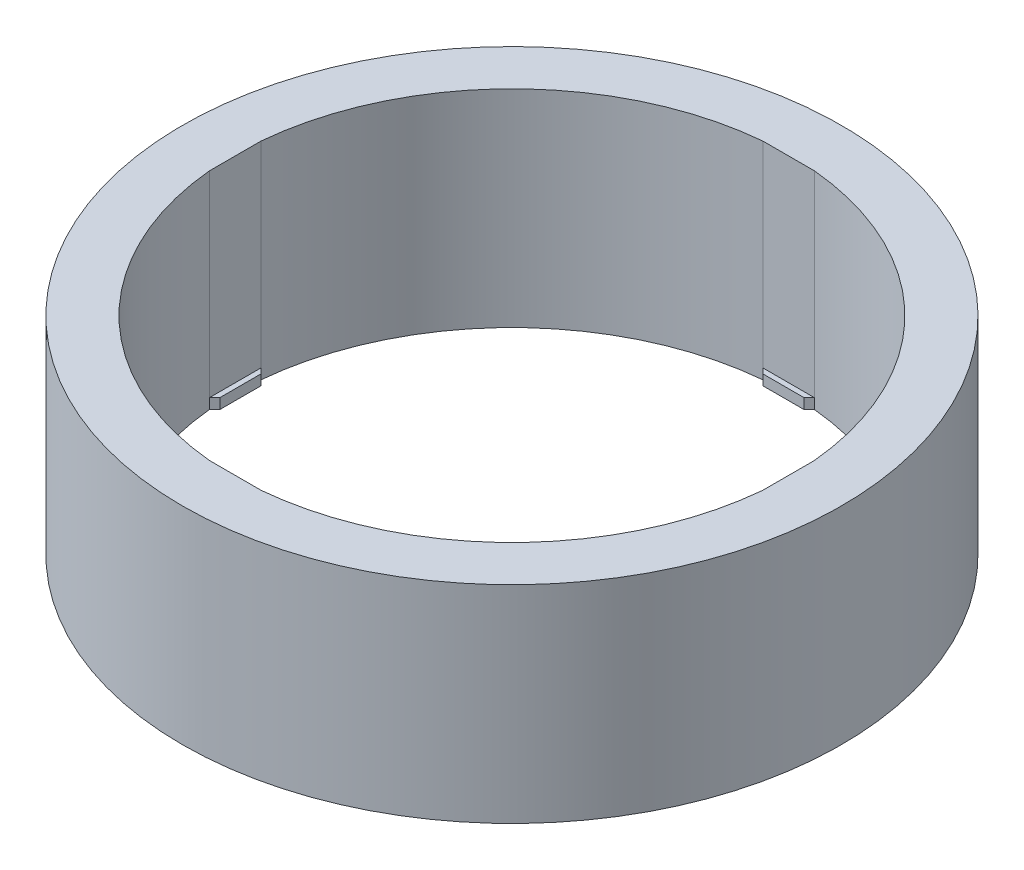
ISO-10303-21;
HEADER;
FILE_DESCRIPTION(('STEP AP214'),'2;1');
FILE_NAME('part.step','',(''),(''),'','','');
FILE_SCHEMA(('AUTOMOTIVE_DESIGN { 1 0 10303 214 1 1 1 1 }'));
ENDSEC;
DATA;
#1=APPLICATION_CONTEXT('core data for automotive mechanical design processes');
#2=APPLICATION_PROTOCOL_DEFINITION('international standard','automotive_design',2000,#1);
#3=PRODUCT_CONTEXT('',#1,'mechanical');
#4=PRODUCT('Part','Part','',(#3));
#5=PRODUCT_RELATED_PRODUCT_CATEGORY('part','',(#4));
#6=PRODUCT_DEFINITION_FORMATION('','',#4);
#7=PRODUCT_DEFINITION_CONTEXT('part definition',#1,'design');
#8=PRODUCT_DEFINITION('design','',#6,#7);
#9=PRODUCT_DEFINITION_SHAPE('','',#8);
#10=(LENGTH_UNIT() NAMED_UNIT(*) SI_UNIT(.MILLI.,.METRE.));
#11=(NAMED_UNIT(*) PLANE_ANGLE_UNIT() SI_UNIT($,.RADIAN.));
#12=(NAMED_UNIT(*) SI_UNIT($,.STERADIAN.) SOLID_ANGLE_UNIT());
#13=UNCERTAINTY_MEASURE_WITH_UNIT(LENGTH_MEASURE(1.E-05),#10,'distance_accuracy_value','');
#14=(GEOMETRIC_REPRESENTATION_CONTEXT(3) GLOBAL_UNCERTAINTY_ASSIGNED_CONTEXT((#13)) GLOBAL_UNIT_ASSIGNED_CONTEXT((#10,
#11,#12)) REPRESENTATION_CONTEXT('',''));
#15=CARTESIAN_POINT('',(0.,0.,0.));
#16=DIRECTION('',(0.,0.,1.));
#17=DIRECTION('',(1.,0.,0.));
#18=AXIS2_PLACEMENT_3D('',#15,#16,#17);
#19=CARTESIAN_POINT('',(10.7033873143038,8.,-0.999999999999966));
#20=DIRECTION('',(-1.,0.,0.));
#21=DIRECTION('',(0.,0.,1.));
#22=AXIS2_PLACEMENT_3D('',#19,#20,#21);
#23=PLANE('',#22);
#24=DIRECTION('',(0.,-1.,0.));
#25=VECTOR('',#24,1.);
#26=CARTESIAN_POINT('',(10.7033873143038,8.,-0.999999999999964));
#27=LINE('',#26,#25);
#28=CARTESIAN_POINT('',(10.7033873143038,8.,-0.999999999999964));
#29=VERTEX_POINT('',#28);
#30=CARTESIAN_POINT('',(10.7033873143038,0.4,-0.999999999999964));
#31=VERTEX_POINT('',#30);
#32=EDGE_CURVE('E273',#29,#31,#27,.T.);
#33=ORIENTED_EDGE('',*,*,#32,.T.);
#34=DIRECTION('',(0.,0.,-1.));
#35=VECTOR('',#34,1.);
#36=CARTESIAN_POINT('',(10.7033873143038,0.4,-0.999999999999964));
#37=LINE('',#36,#35);
#38=CARTESIAN_POINT('',(10.7033873143038,0.4,1.00000000000004));
#39=VERTEX_POINT('',#38);
#40=EDGE_CURVE('E196',#39,#31,#37,.T.);
#41=ORIENTED_EDGE('',*,*,#40,.F.);
#42=DIRECTION('',(0.,-1.,0.));
#43=VECTOR('',#42,1.);
#44=CARTESIAN_POINT('',(10.7033873143038,8.,1.00000000000004));
#45=LINE('',#44,#43);
#46=CARTESIAN_POINT('',(10.7033873143038,8.,1.00000000000004));
#47=VERTEX_POINT('',#46);
#48=EDGE_CURVE('E275',#47,#39,#45,.T.);
#49=ORIENTED_EDGE('',*,*,#48,.F.);
#50=DIRECTION('',(0.,0.,-1.));
#51=VECTOR('',#50,1.);
#52=CARTESIAN_POINT('',(10.7033873143038,8.,-0.999999999999966));
#53=LINE('',#52,#51);
#54=EDGE_CURVE('E255',#47,#29,#53,.T.);
#55=ORIENTED_EDGE('',*,*,#54,.T.);
#56=EDGE_LOOP('',(#33,#41,#49,#55));
#57=FACE_BOUND('',#56,.T.);
#58=ADVANCED_FACE('F33',(#57),#23,.T.);
#59=CARTESIAN_POINT('',(0.999999999999926,8.,10.7033873143038));
#60=DIRECTION('',(0.,0.,-1.));
#61=DIRECTION('',(-1.,0.,0.));
#62=AXIS2_PLACEMENT_3D('',#59,#60,#61);
#63=PLANE('',#62);
#64=DIRECTION('',(0.,-1.,0.));
#65=VECTOR('',#64,1.);
#66=CARTESIAN_POINT('',(0.999999999999926,8.,10.7033873143038));
#67=LINE('',#66,#65);
#68=CARTESIAN_POINT('',(0.999999999999926,8.,10.7033873143038));
#69=VERTEX_POINT('',#68);
#70=CARTESIAN_POINT('',(0.999999999999926,0.4,10.7033873143038));
#71=VERTEX_POINT('',#70);
#72=EDGE_CURVE('E278',#69,#71,#67,.T.);
#73=ORIENTED_EDGE('',*,*,#72,.T.);
#74=DIRECTION('',(1.,0.,0.));
#75=VECTOR('',#74,1.);
#76=CARTESIAN_POINT('',(0.999999999999926,0.4,10.7033873143038));
#77=LINE('',#76,#75);
#78=CARTESIAN_POINT('',(-1.00000000000008,0.4,10.7033873143038));
#79=VERTEX_POINT('',#78);
#80=EDGE_CURVE('E207',#79,#71,#77,.T.);
#81=ORIENTED_EDGE('',*,*,#80,.F.);
#82=DIRECTION('',(0.,-1.,0.));
#83=VECTOR('',#82,1.);
#84=CARTESIAN_POINT('',(-1.00000000000008,8.,10.7033873143038));
#85=LINE('',#84,#83);
#86=CARTESIAN_POINT('',(-1.00000000000008,8.,10.7033873143038));
#87=VERTEX_POINT('',#86);
#88=EDGE_CURVE('E281',#87,#79,#85,.T.);
#89=ORIENTED_EDGE('',*,*,#88,.F.);
#90=DIRECTION('',(1.,0.,0.));
#91=VECTOR('',#90,1.);
#92=CARTESIAN_POINT('',(0.999999999999926,8.,10.7033873143038));
#93=LINE('',#92,#91);
#94=EDGE_CURVE('E251',#87,#69,#93,.T.);
#95=ORIENTED_EDGE('',*,*,#94,.T.);
#96=EDGE_LOOP('',(#73,#81,#89,#95));
#97=FACE_BOUND('',#96,.T.);
#98=ADVANCED_FACE('F366',(#97),#63,.T.);
#99=CARTESIAN_POINT('',(-10.7033873143038,8.,0.999999999999891));
#100=DIRECTION('',(1.,0.,0.));
#101=DIRECTION('',(0.,0.,-1.));
#102=AXIS2_PLACEMENT_3D('',#99,#100,#101);
#103=PLANE('',#102);
#104=DIRECTION('',(0.,-1.,0.));
#105=VECTOR('',#104,1.);
#106=CARTESIAN_POINT('',(-10.7033873143038,8.,0.999999999999889));
#107=LINE('',#106,#105);
#108=CARTESIAN_POINT('',(-10.7033873143038,8.,0.999999999999889));
#109=VERTEX_POINT('',#108);
#110=CARTESIAN_POINT('',(-10.7033873143038,0.4,0.999999999999889));
#111=VERTEX_POINT('',#110);
#112=EDGE_CURVE('E284',#109,#111,#107,.T.);
#113=ORIENTED_EDGE('',*,*,#112,.T.);
#114=DIRECTION('',(0.,0.,1.));
#115=VECTOR('',#114,1.);
#116=CARTESIAN_POINT('',(-10.7033873143038,0.4,0.999999999999889));
#117=LINE('',#116,#115);
#118=CARTESIAN_POINT('',(-10.7033873143038,0.4,-1.00000000000011));
#119=VERTEX_POINT('',#118);
#120=EDGE_CURVE('E223',#119,#111,#117,.T.);
#121=ORIENTED_EDGE('',*,*,#120,.F.);
#122=DIRECTION('',(0.,-1.,0.));
#123=VECTOR('',#122,1.);
#124=CARTESIAN_POINT('',(-10.7033873143038,8.,-1.00000000000011));
#125=LINE('',#124,#123);
#126=CARTESIAN_POINT('',(-10.7033873143038,8.,-1.00000000000011));
#127=VERTEX_POINT('',#126);
#128=EDGE_CURVE('E287',#127,#119,#125,.T.);
#129=ORIENTED_EDGE('',*,*,#128,.F.);
#130=DIRECTION('',(0.,0.,1.));
#131=VECTOR('',#130,1.);
#132=CARTESIAN_POINT('',(-10.7033873143038,8.,0.999999999999891));
#133=LINE('',#132,#131);
#134=EDGE_CURVE('E247',#127,#109,#133,.T.);
#135=ORIENTED_EDGE('',*,*,#134,.T.);
#136=EDGE_LOOP('',(#113,#121,#129,#135));
#137=FACE_BOUND('',#136,.T.);
#138=ADVANCED_FACE('F371',(#137),#103,.T.);
#139=CARTESIAN_POINT('',(-1.,8.,-10.7033873143038));
#140=DIRECTION('',(0.,0.,1.));
#141=DIRECTION('',(1.,0.,0.));
#142=AXIS2_PLACEMENT_3D('',#139,#140,#141);
#143=PLANE('',#142);
#144=DIRECTION('',(0.,-1.,0.));
#145=VECTOR('',#144,1.);
#146=CARTESIAN_POINT('',(-1.,8.,-10.7033873143038));
#147=LINE('',#146,#145);
#148=CARTESIAN_POINT('',(-1.,8.,-10.7033873143038));
#149=VERTEX_POINT('',#148);
#150=CARTESIAN_POINT('',(-1.,0.4,-10.7033873143038));
#151=VERTEX_POINT('',#150);
#152=EDGE_CURVE('E262',#149,#151,#147,.T.);
#153=ORIENTED_EDGE('',*,*,#152,.T.);
#154=DIRECTION('',(-1.,0.,0.));
#155=VECTOR('',#154,1.);
#156=CARTESIAN_POINT('',(-1.,0.4,-10.7033873143038));
#157=LINE('',#156,#155);
#158=CARTESIAN_POINT('',(1.,0.4,-10.7033873143038));
#159=VERTEX_POINT('',#158);
#160=EDGE_CURVE('E238',#159,#151,#157,.T.);
#161=ORIENTED_EDGE('',*,*,#160,.F.);
#162=DIRECTION('',(0.,-1.,0.));
#163=VECTOR('',#162,1.);
#164=CARTESIAN_POINT('',(1.,8.,-10.7033873143038));
#165=LINE('',#164,#163);
#166=CARTESIAN_POINT('',(1.,8.,-10.7033873143038));
#167=VERTEX_POINT('',#166);
#168=EDGE_CURVE('E271',#167,#159,#165,.T.);
#169=ORIENTED_EDGE('',*,*,#168,.F.);
#170=DIRECTION('',(-1.,0.,0.));
#171=VECTOR('',#170,1.);
#172=CARTESIAN_POINT('',(-1.,8.,-10.7033873143038));
#173=LINE('',#172,#171);
#174=EDGE_CURVE('E260',#167,#149,#173,.T.);
#175=ORIENTED_EDGE('',*,*,#174,.T.);
#176=EDGE_LOOP('',(#153,#161,#169,#175));
#177=FACE_BOUND('',#176,.T.);
#178=ADVANCED_FACE('F386',(#177),#143,.T.);
#179=CARTESIAN_POINT('',(0.,8.,0.));
#180=DIRECTION('',(0.,1.,0.));
#181=DIRECTION('',(0.,0.,1.));
#182=AXIS2_PLACEMENT_3D('',#179,#180,#181);
#183=PLANE('',#182);
#184=CARTESIAN_POINT('',(0.,8.,0.));
#185=DIRECTION('',(0.,1.,0.));
#186=DIRECTION('',(0.,0.,1.));
#187=AXIS2_PLACEMENT_3D('',#184,#185,#186);
#188=CIRCLE('',#187,12.75);
#189=CARTESIAN_POINT('',(0.,8.,12.75));
#190=VERTEX_POINT('',#189);
#191=EDGE_CURVE('E291',#190,#190,#188,.T.);
#192=ORIENTED_EDGE('',*,*,#191,.T.);
#193=EDGE_LOOP('',(#192));
#194=FACE_BOUND('',#193,.T.);
#195=ORIENTED_EDGE('',*,*,#134,.F.);
#196=CARTESIAN_POINT('',(0.,8.,0.));
#197=DIRECTION('',(0.,1.,0.));
#198=DIRECTION('',(0.,0.,1.));
#199=AXIS2_PLACEMENT_3D('',#196,#197,#198);
#200=CIRCLE('',#199,10.75);
#201=EDGE_CURVE('E191',#149,#127,#200,.T.);
#202=ORIENTED_EDGE('',*,*,#201,.F.);
#203=ORIENTED_EDGE('',*,*,#174,.F.);
#204=CARTESIAN_POINT('',(0.,8.,0.));
#205=DIRECTION('',(0.,1.,0.));
#206=DIRECTION('',(0.,0.,1.));
#207=AXIS2_PLACEMENT_3D('',#204,#205,#206);
#208=CIRCLE('',#207,10.75);
#209=EDGE_CURVE('E257',#29,#167,#208,.T.);
#210=ORIENTED_EDGE('',*,*,#209,.F.);
#211=ORIENTED_EDGE('',*,*,#54,.F.);
#212=CARTESIAN_POINT('',(0.,8.,0.));
#213=DIRECTION('',(0.,1.,0.));
#214=DIRECTION('',(0.,0.,1.));
#215=AXIS2_PLACEMENT_3D('',#212,#213,#214);
#216=CIRCLE('',#215,10.75);
#217=EDGE_CURVE('E253',#69,#47,#216,.T.);
#218=ORIENTED_EDGE('',*,*,#217,.F.);
#219=ORIENTED_EDGE('',*,*,#94,.F.);
#220=CARTESIAN_POINT('',(0.,8.,0.));
#221=DIRECTION('',(0.,1.,0.));
#222=DIRECTION('',(0.,0.,1.));
#223=AXIS2_PLACEMENT_3D('',#220,#221,#222);
#224=CIRCLE('',#223,10.75);
#225=EDGE_CURVE('E249',#109,#87,#224,.T.);
#226=ORIENTED_EDGE('',*,*,#225,.F.);
#227=EDGE_LOOP('',(#195,#202,#203,#210,#211,#218,#219,#226));
#228=FACE_BOUND('',#227,.T.);
#229=ADVANCED_FACE('F392',(#194,#228),#183,.T.);
#230=CARTESIAN_POINT('',(0.,0.,0.));
#231=DIRECTION('',(0.,1.,0.));
#232=DIRECTION('',(0.,0.,1.));
#233=AXIS2_PLACEMENT_3D('',#230,#231,#232);
#234=PLANE('',#233);
#235=CARTESIAN_POINT('',(0.,0.,0.));
#236=DIRECTION('',(0.,1.,0.));
#237=DIRECTION('',(0.,0.,1.));
#238=AXIS2_PLACEMENT_3D('',#235,#236,#237);
#239=CIRCLE('',#238,12.75);
#240=CARTESIAN_POINT('',(0.,0.,12.75));
#241=VERTEX_POINT('',#240);
#242=EDGE_CURVE('E290',#241,#241,#239,.T.);
#243=ORIENTED_EDGE('',*,*,#242,.F.);
#244=EDGE_LOOP('',(#243));
#245=FACE_BOUND('',#244,.T.);
#246=CARTESIAN_POINT('',(0.,0.,0.));
#247=DIRECTION('',(0.,1.,0.));
#248=DIRECTION('',(0.,0.,1.));
#249=AXIS2_PLACEMENT_3D('',#246,#247,#248);
#250=CIRCLE('',#249,10.75);
#251=CARTESIAN_POINT('',(0.999999999999926,0.,10.7033873143038));
#252=VERTEX_POINT('',#251);
#253=CARTESIAN_POINT('',(10.7033873143038,0.,1.00000000000004));
#254=VERTEX_POINT('',#253);
#255=EDGE_CURVE('E192',#252,#254,#250,.T.);
#256=ORIENTED_EDGE('',*,*,#255,.T.);
#257=DIRECTION('',(0.707106781186541,0.,0.707106781186554));
#258=VECTOR('',#257,1.);
#259=CARTESIAN_POINT('',(10.5033873143038,0.,0.800000000000035));
#260=LINE('',#259,#258);
#261=CARTESIAN_POINT('',(10.5033873143038,0.,0.800000000000035));
#262=VERTEX_POINT('',#261);
#263=EDGE_CURVE('E11',#254,#262,#260,.F.);
#264=ORIENTED_EDGE('',*,*,#263,.T.);
#265=DIRECTION('',(0.,0.,1.));
#266=VECTOR('',#265,1.);
#267=CARTESIAN_POINT('',(10.5033873143038,0.,-0.999999999999965));
#268=LINE('',#267,#266);
#269=CARTESIAN_POINT('',(10.5033873143038,0.,-0.799999999999965));
#270=VERTEX_POINT('',#269);
#271=EDGE_CURVE('E178',#270,#262,#268,.T.);
#272=ORIENTED_EDGE('',*,*,#271,.F.);
#273=DIRECTION('',(-0.707106781186554,0.,0.707106781186541));
#274=VECTOR('',#273,1.);
#275=CARTESIAN_POINT('',(10.5033873143038,0.,-0.799999999999966));
#276=LINE('',#275,#274);
#277=CARTESIAN_POINT('',(10.7033873143038,0.,-0.999999999999964));
#278=VERTEX_POINT('',#277);
#279=EDGE_CURVE('E41',#270,#278,#276,.F.);
#280=ORIENTED_EDGE('',*,*,#279,.T.);
#281=CARTESIAN_POINT('',(0.,0.,0.));
#282=DIRECTION('',(0.,1.,0.));
#283=DIRECTION('',(0.,0.,1.));
#284=AXIS2_PLACEMENT_3D('',#281,#282,#283);
#285=CIRCLE('',#284,10.75);
#286=CARTESIAN_POINT('',(1.,0.,-10.7033873143038));
#287=VERTEX_POINT('',#286);
#288=EDGE_CURVE('E175',#278,#287,#285,.T.);
#289=ORIENTED_EDGE('',*,*,#288,.T.);
#290=DIRECTION('',(0.707106781186554,0.,-0.707106781186541));
#291=VECTOR('',#290,1.);
#292=CARTESIAN_POINT('',(0.799999999999999,0.,-10.5033873143038));
#293=LINE('',#292,#291);
#294=CARTESIAN_POINT('',(0.799999999999999,0.,-10.5033873143038));
#295=VERTEX_POINT('',#294);
#296=EDGE_CURVE('E316',#287,#295,#293,.F.);
#297=ORIENTED_EDGE('',*,*,#296,.T.);
#298=DIRECTION('',(1.,0.,0.));
#299=VECTOR('',#298,1.);
#300=CARTESIAN_POINT('',(-1.,0.,-10.5033873143038));
#301=LINE('',#300,#299);
#302=CARTESIAN_POINT('',(-0.799999999999999,0.,-10.5033873143038));
#303=VERTEX_POINT('',#302);
#304=EDGE_CURVE('E234',#303,#295,#301,.T.);
#305=ORIENTED_EDGE('',*,*,#304,.F.);
#306=DIRECTION('',(0.707106781186554,0.,0.707106781186541));
#307=VECTOR('',#306,1.);
#308=CARTESIAN_POINT('',(-0.799999999999999,0.,-10.5033873143038));
#309=LINE('',#308,#307);
#310=CARTESIAN_POINT('',(-1.,0.,-10.7033873143038));
#311=VERTEX_POINT('',#310);
#312=EDGE_CURVE('E314',#303,#311,#309,.F.);
#313=ORIENTED_EDGE('',*,*,#312,.T.);
#314=CARTESIAN_POINT('',(0.,0.,0.));
#315=DIRECTION('',(0.,1.,0.));
#316=DIRECTION('',(0.,0.,1.));
#317=AXIS2_PLACEMENT_3D('',#314,#315,#316);
#318=CIRCLE('',#317,10.75);
#319=CARTESIAN_POINT('',(-10.7033873143038,0.,-1.00000000000011));
#320=VERTEX_POINT('',#319);
#321=EDGE_CURVE('E241',#311,#320,#318,.T.);
#322=ORIENTED_EDGE('',*,*,#321,.T.);
#323=DIRECTION('',(-0.707106781186535,0.,-0.70710678118656));
#324=VECTOR('',#323,1.);
#325=CARTESIAN_POINT('',(-10.5033873143038,0.,-0.800000000000102));
#326=LINE('',#325,#324);
#327=CARTESIAN_POINT('',(-10.5033873143038,0.,-0.800000000000103));
#328=VERTEX_POINT('',#327);
#329=EDGE_CURVE('E310',#320,#328,#326,.F.);
#330=ORIENTED_EDGE('',*,*,#329,.T.);
#331=DIRECTION('',(0.,0.,-1.));
#332=VECTOR('',#331,1.);
#333=CARTESIAN_POINT('',(-10.5033873143038,0.,0.999999999999892));
#334=LINE('',#333,#332);
#335=CARTESIAN_POINT('',(-10.5033873143038,0.,0.799999999999897));
#336=VERTEX_POINT('',#335);
#337=EDGE_CURVE('E219',#336,#328,#334,.T.);
#338=ORIENTED_EDGE('',*,*,#337,.F.);
#339=DIRECTION('',(0.70710678118656,0.,-0.707106781186535));
#340=VECTOR('',#339,1.);
#341=CARTESIAN_POINT('',(-10.5033873143038,0.,0.799999999999898));
#342=LINE('',#341,#340);
#343=CARTESIAN_POINT('',(-10.7033873143038,0.,0.999999999999889));
#344=VERTEX_POINT('',#343);
#345=EDGE_CURVE('E312',#336,#344,#342,.F.);
#346=ORIENTED_EDGE('',*,*,#345,.T.);
#347=CARTESIAN_POINT('',(0.,0.,0.));
#348=DIRECTION('',(0.,1.,0.));
#349=DIRECTION('',(0.,0.,1.));
#350=AXIS2_PLACEMENT_3D('',#347,#348,#349);
#351=CIRCLE('',#350,10.75);
#352=CARTESIAN_POINT('',(-1.00000000000008,0.,10.7033873143038));
#353=VERTEX_POINT('',#352);
#354=EDGE_CURVE('E265',#344,#353,#351,.T.);
#355=ORIENTED_EDGE('',*,*,#354,.T.);
#356=DIRECTION('',(-0.707106781186553,0.,0.707106781186542));
#357=VECTOR('',#356,1.);
#358=CARTESIAN_POINT('',(-0.800000000000074,0.,10.5033873143038));
#359=LINE('',#358,#357);
#360=CARTESIAN_POINT('',(-0.800000000000074,0.,10.5033873143038));
#361=VERTEX_POINT('',#360);
#362=EDGE_CURVE('E308',#353,#361,#359,.F.);
#363=ORIENTED_EDGE('',*,*,#362,.T.);
#364=DIRECTION('',(-1.,0.,0.));
#365=VECTOR('',#364,1.);
#366=CARTESIAN_POINT('',(0.999999999999927,0.,10.5033873143038));
#367=LINE('',#366,#365);
#368=CARTESIAN_POINT('',(0.799999999999928,0.,10.5033873143038));
#369=VERTEX_POINT('',#368);
#370=EDGE_CURVE('E203',#369,#361,#367,.T.);
#371=ORIENTED_EDGE('',*,*,#370,.F.);
#372=DIRECTION('',(-0.707106781186542,0.,-0.707106781186553));
#373=VECTOR('',#372,1.);
#374=CARTESIAN_POINT('',(0.799999999999927,0.,10.5033873143038));
#375=LINE('',#374,#373);
#376=EDGE_CURVE('E306',#369,#252,#375,.F.);
#377=ORIENTED_EDGE('',*,*,#376,.T.);
#378=EDGE_LOOP('',(#256,#264,#272,#280,#289,#297,#305,#313,#322,#330,#338,#346,#355,#363,#371,#377));
#379=FACE_BOUND('',#378,.T.);
#380=ADVANCED_FACE('F174',(#245,#379),#234,.F.);
#381=CARTESIAN_POINT('',(0.,8.,0.));
#382=DIRECTION('',(0.,-1.,0.));
#383=DIRECTION('',(0.,0.,-1.));
#384=AXIS2_PLACEMENT_3D('',#381,#382,#383);
#385=CYLINDRICAL_SURFACE('',#384,12.75);
#386=ORIENTED_EDGE('',*,*,#191,.F.);
#387=EDGE_LOOP('',(#386));
#388=FACE_BOUND('',#387,.T.);
#389=ORIENTED_EDGE('',*,*,#242,.T.);
#390=EDGE_LOOP('',(#389));
#391=FACE_BOUND('',#390,.T.);
#392=ADVANCED_FACE('F390',(#388,#391),#385,.T.);
#393=CARTESIAN_POINT('',(0.,8.,0.));
#394=DIRECTION('',(0.,-1.,0.));
#395=DIRECTION('',(0.,0.,-1.));
#396=AXIS2_PLACEMENT_3D('',#393,#394,#395);
#397=CYLINDRICAL_SURFACE('',#396,10.75);
#398=ORIENTED_EDGE('',*,*,#321,.F.);
#399=DIRECTION('',(0.,-1.,0.));
#400=VECTOR('',#399,1.);
#401=CARTESIAN_POINT('',(-1.,0.,-10.7033873143038));
#402=LINE('',#401,#400);
#403=EDGE_CURVE('E226',#151,#311,#402,.T.);
#404=ORIENTED_EDGE('',*,*,#403,.F.);
#405=ORIENTED_EDGE('',*,*,#152,.F.);
#406=ORIENTED_EDGE('',*,*,#201,.T.);
#407=ORIENTED_EDGE('',*,*,#128,.T.);
#408=DIRECTION('',(0.,1.,0.));
#409=VECTOR('',#408,1.);
#410=CARTESIAN_POINT('',(-10.7033873143038,0.,-1.00000000000011));
#411=LINE('',#410,#409);
#412=EDGE_CURVE('E229',#320,#119,#411,.T.);
#413=ORIENTED_EDGE('',*,*,#412,.F.);
#414=EDGE_LOOP('',(#398,#404,#405,#406,#407,#413));
#415=FACE_BOUND('',#414,.T.);
#416=ADVANCED_FACE('F382',(#415),#397,.F.);
#417=CARTESIAN_POINT('',(0.,8.,0.));
#418=DIRECTION('',(0.,-1.,0.));
#419=DIRECTION('',(0.,0.,-1.));
#420=AXIS2_PLACEMENT_3D('',#417,#418,#419);
#421=CYLINDRICAL_SURFACE('',#420,10.75);
#422=ORIENTED_EDGE('',*,*,#354,.F.);
#423=DIRECTION('',(0.,-1.,0.));
#424=VECTOR('',#423,1.);
#425=CARTESIAN_POINT('',(-10.7033873143038,0.,0.999999999999889));
#426=LINE('',#425,#424);
#427=EDGE_CURVE('E210',#111,#344,#426,.T.);
#428=ORIENTED_EDGE('',*,*,#427,.F.);
#429=ORIENTED_EDGE('',*,*,#112,.F.);
#430=ORIENTED_EDGE('',*,*,#225,.T.);
#431=ORIENTED_EDGE('',*,*,#88,.T.);
#432=DIRECTION('',(0.,1.,0.));
#433=VECTOR('',#432,1.);
#434=CARTESIAN_POINT('',(-1.00000000000008,0.,10.7033873143038));
#435=LINE('',#434,#433);
#436=EDGE_CURVE('E214',#353,#79,#435,.T.);
#437=ORIENTED_EDGE('',*,*,#436,.F.);
#438=EDGE_LOOP('',(#422,#428,#429,#430,#431,#437));
#439=FACE_BOUND('',#438,.T.);
#440=ADVANCED_FACE('F378',(#439),#421,.F.);
#441=CARTESIAN_POINT('',(0.,8.,0.));
#442=DIRECTION('',(0.,-1.,0.));
#443=DIRECTION('',(0.,0.,-1.));
#444=AXIS2_PLACEMENT_3D('',#441,#442,#443);
#445=CYLINDRICAL_SURFACE('',#444,10.75);
#446=ORIENTED_EDGE('',*,*,#255,.F.);
#447=DIRECTION('',(0.,-1.,0.));
#448=VECTOR('',#447,1.);
#449=CARTESIAN_POINT('',(0.999999999999926,0.,10.7033873143038));
#450=LINE('',#449,#448);
#451=EDGE_CURVE('E211',#71,#252,#450,.T.);
#452=ORIENTED_EDGE('',*,*,#451,.F.);
#453=ORIENTED_EDGE('',*,*,#72,.F.);
#454=ORIENTED_EDGE('',*,*,#217,.T.);
#455=ORIENTED_EDGE('',*,*,#48,.T.);
#456=DIRECTION('',(0.,1.,0.));
#457=VECTOR('',#456,1.);
#458=CARTESIAN_POINT('',(10.7033873143038,0.,1.00000000000004));
#459=LINE('',#458,#457);
#460=EDGE_CURVE('E194',#254,#39,#459,.T.);
#461=ORIENTED_EDGE('',*,*,#460,.F.);
#462=EDGE_LOOP('',(#446,#452,#453,#454,#455,#461));
#463=FACE_BOUND('',#462,.T.);
#464=ADVANCED_FACE('F350',(#463),#445,.F.);
#465=CARTESIAN_POINT('',(0.,8.,0.));
#466=DIRECTION('',(0.,-1.,0.));
#467=DIRECTION('',(0.,0.,-1.));
#468=AXIS2_PLACEMENT_3D('',#465,#466,#467);
#469=CYLINDRICAL_SURFACE('',#468,10.75);
#470=ORIENTED_EDGE('',*,*,#288,.F.);
#471=DIRECTION('',(0.,-1.,0.));
#472=VECTOR('',#471,1.);
#473=CARTESIAN_POINT('',(10.7033873143038,0.,-0.999999999999964));
#474=LINE('',#473,#472);
#475=EDGE_CURVE('E186',#31,#278,#474,.T.);
#476=ORIENTED_EDGE('',*,*,#475,.F.);
#477=ORIENTED_EDGE('',*,*,#32,.F.);
#478=ORIENTED_EDGE('',*,*,#209,.T.);
#479=ORIENTED_EDGE('',*,*,#168,.T.);
#480=DIRECTION('',(0.,1.,0.));
#481=VECTOR('',#480,1.);
#482=CARTESIAN_POINT('',(1.,0.,-10.7033873143038));
#483=LINE('',#482,#481);
#484=EDGE_CURVE('E190',#287,#159,#483,.T.);
#485=ORIENTED_EDGE('',*,*,#484,.F.);
#486=EDGE_LOOP('',(#470,#476,#477,#478,#479,#485));
#487=FACE_BOUND('',#486,.T.);
#488=ADVANCED_FACE('F184',(#487),#469,.F.);
#489=CARTESIAN_POINT('',(-1.,0.4,-10.5033873143038));
#490=DIRECTION('',(0.,-1.,0.));
#491=DIRECTION('',(1.,0.,0.));
#492=AXIS2_PLACEMENT_3D('',#489,#490,#491);
#493=PLANE('',#492);
#494=DIRECTION('',(-1.,0.,0.));
#495=VECTOR('',#494,1.);
#496=CARTESIAN_POINT('',(-1.,0.4,-10.5033873143038));
#497=LINE('',#496,#495);
#498=CARTESIAN_POINT('',(0.799999999999999,0.4,-10.5033873143038));
#499=VERTEX_POINT('',#498);
#500=CARTESIAN_POINT('',(-0.799999999999999,0.4,-10.5033873143038));
#501=VERTEX_POINT('',#500);
#502=EDGE_CURVE('E237',#499,#501,#497,.T.);
#503=ORIENTED_EDGE('',*,*,#502,.F.);
#504=DIRECTION('',(-0.707106781186554,0.,0.707106781186541));
#505=VECTOR('',#504,1.);
#506=CARTESIAN_POINT('',(0.799999999999999,0.4,-10.5033873143038));
#507=LINE('',#506,#505);
#508=EDGE_CURVE('E304',#499,#159,#507,.F.);
#509=ORIENTED_EDGE('',*,*,#508,.T.);
#510=ORIENTED_EDGE('',*,*,#160,.T.);
#511=DIRECTION('',(-0.707106781186554,0.,-0.707106781186541));
#512=VECTOR('',#511,1.);
#513=CARTESIAN_POINT('',(-0.799999999999999,0.4,-10.5033873143038));
#514=LINE('',#513,#512);
#515=EDGE_CURVE('E302',#151,#501,#514,.F.);
#516=ORIENTED_EDGE('',*,*,#515,.T.);
#517=EDGE_LOOP('',(#503,#509,#510,#516));
#518=FACE_BOUND('',#517,.T.);
#519=ADVANCED_FACE('F457',(#518),#493,.F.);
#520=CARTESIAN_POINT('',(0.,0.,-10.5033873143038));
#521=DIRECTION('',(0.,0.,-1.));
#522=DIRECTION('',(-1.,0.,0.));
#523=AXIS2_PLACEMENT_3D('',#520,#521,#522);
#524=PLANE('',#523);
#525=ORIENTED_EDGE('',*,*,#304,.T.);
#526=DIRECTION('',(0.,1.,0.));
#527=VECTOR('',#526,1.);
#528=CARTESIAN_POINT('',(0.799999999999999,0.,-10.5033873143038));
#529=LINE('',#528,#527);
#530=EDGE_CURVE('E299',#295,#499,#529,.T.);
#531=ORIENTED_EDGE('',*,*,#530,.T.);
#532=ORIENTED_EDGE('',*,*,#502,.T.);
#533=DIRECTION('',(0.,-1.,0.));
#534=VECTOR('',#533,1.);
#535=CARTESIAN_POINT('',(-0.799999999999999,0.,-10.5033873143038));
#536=LINE('',#535,#534);
#537=EDGE_CURVE('E294',#501,#303,#536,.T.);
#538=ORIENTED_EDGE('',*,*,#537,.T.);
#539=EDGE_LOOP('',(#525,#531,#532,#538));
#540=FACE_BOUND('',#539,.T.);
#541=ADVANCED_FACE('F459',(#540),#524,.F.);
#542=CARTESIAN_POINT('',(-10.5033873143038,0.4,0.999999999999892));
#543=DIRECTION('',(0.,-1.,0.));
#544=DIRECTION('',(0.,0.,-1.));
#545=AXIS2_PLACEMENT_3D('',#542,#543,#544);
#546=PLANE('',#545);
#547=ORIENTED_EDGE('',*,*,#120,.T.);
#548=DIRECTION('',(-0.70710678118656,0.,0.707106781186535));
#549=VECTOR('',#548,1.);
#550=CARTESIAN_POINT('',(-10.5033873143038,0.4,0.799999999999898));
#551=LINE('',#550,#549);
#552=CARTESIAN_POINT('',(-10.5033873143038,0.4,0.799999999999897));
#553=VERTEX_POINT('',#552);
#554=EDGE_CURVE('E326',#111,#553,#551,.F.);
#555=ORIENTED_EDGE('',*,*,#554,.T.);
#556=DIRECTION('',(0.,0.,1.));
#557=VECTOR('',#556,1.);
#558=CARTESIAN_POINT('',(-10.5033873143038,0.4,0.999999999999892));
#559=LINE('',#558,#557);
#560=CARTESIAN_POINT('',(-10.5033873143038,0.4,-0.800000000000103));
#561=VERTEX_POINT('',#560);
#562=EDGE_CURVE('E222',#561,#553,#559,.T.);
#563=ORIENTED_EDGE('',*,*,#562,.F.);
#564=DIRECTION('',(0.707106781186535,0.,0.70710678118656));
#565=VECTOR('',#564,1.);
#566=CARTESIAN_POINT('',(-10.5033873143038,0.4,-0.800000000000102));
#567=LINE('',#566,#565);
#568=EDGE_CURVE('E324',#561,#119,#567,.F.);
#569=ORIENTED_EDGE('',*,*,#568,.T.);
#570=EDGE_LOOP('',(#547,#555,#563,#569));
#571=FACE_BOUND('',#570,.T.);
#572=ADVANCED_FACE('F470',(#571),#546,.F.);
#573=CARTESIAN_POINT('',(-10.5033873143038,0.,-1.09322835308399E-13));
#574=DIRECTION('',(-1.,0.,0.));
#575=DIRECTION('',(0.,0.,1.));
#576=AXIS2_PLACEMENT_3D('',#573,#574,#575);
#577=PLANE('',#576);
#578=ORIENTED_EDGE('',*,*,#562,.T.);
#579=DIRECTION('',(0.,-1.,0.));
#580=VECTOR('',#579,1.);
#581=CARTESIAN_POINT('',(-10.5033873143038,0.,0.799999999999897));
#582=LINE('',#581,#580);
#583=EDGE_CURVE('E321',#553,#336,#582,.T.);
#584=ORIENTED_EDGE('',*,*,#583,.T.);
#585=ORIENTED_EDGE('',*,*,#337,.T.);
#586=DIRECTION('',(0.,1.,0.));
#587=VECTOR('',#586,1.);
#588=CARTESIAN_POINT('',(-10.5033873143038,0.,-0.800000000000103));
#589=LINE('',#588,#587);
#590=EDGE_CURVE('E318',#328,#561,#589,.T.);
#591=ORIENTED_EDGE('',*,*,#590,.T.);
#592=EDGE_LOOP('',(#578,#584,#585,#591));
#593=FACE_BOUND('',#592,.T.);
#594=ADVANCED_FACE('F467',(#593),#577,.F.);
#595=CARTESIAN_POINT('',(0.999999999999927,0.4,10.5033873143038));
#596=DIRECTION('',(0.,-1.,0.));
#597=DIRECTION('',(1.,0.,0.));
#598=AXIS2_PLACEMENT_3D('',#595,#596,#597);
#599=PLANE('',#598);
#600=DIRECTION('',(1.,0.,0.));
#601=VECTOR('',#600,1.);
#602=CARTESIAN_POINT('',(0.999999999999927,0.4,10.5033873143038));
#603=LINE('',#602,#601);
#604=CARTESIAN_POINT('',(-0.800000000000074,0.4,10.5033873143038));
#605=VERTEX_POINT('',#604);
#606=CARTESIAN_POINT('',(0.799999999999928,0.4,10.5033873143038));
#607=VERTEX_POINT('',#606);
#608=EDGE_CURVE('E206',#605,#607,#603,.T.);
#609=ORIENTED_EDGE('',*,*,#608,.F.);
#610=DIRECTION('',(0.707106781186553,0.,-0.707106781186542));
#611=VECTOR('',#610,1.);
#612=CARTESIAN_POINT('',(-0.800000000000074,0.4,10.5033873143038));
#613=LINE('',#612,#611);
#614=EDGE_CURVE('E336',#605,#79,#613,.F.);
#615=ORIENTED_EDGE('',*,*,#614,.T.);
#616=ORIENTED_EDGE('',*,*,#80,.T.);
#617=DIRECTION('',(0.707106781186542,0.,0.707106781186553));
#618=VECTOR('',#617,1.);
#619=CARTESIAN_POINT('',(0.799999999999927,0.4,10.5033873143038));
#620=LINE('',#619,#618);
#621=EDGE_CURVE('E334',#71,#607,#620,.F.);
#622=ORIENTED_EDGE('',*,*,#621,.T.);
#623=EDGE_LOOP('',(#609,#615,#616,#622));
#624=FACE_BOUND('',#623,.T.);
#625=ADVANCED_FACE('F431',(#624),#599,.F.);
#626=CARTESIAN_POINT('',(0.,0.,10.5033873143038));
#627=DIRECTION('',(0.,0.,1.));
#628=DIRECTION('',(1.,0.,0.));
#629=AXIS2_PLACEMENT_3D('',#626,#627,#628);
#630=PLANE('',#629);
#631=ORIENTED_EDGE('',*,*,#370,.T.);
#632=DIRECTION('',(0.,1.,0.));
#633=VECTOR('',#632,1.);
#634=CARTESIAN_POINT('',(-0.800000000000074,0.,10.5033873143038));
#635=LINE('',#634,#633);
#636=EDGE_CURVE('E331',#361,#605,#635,.T.);
#637=ORIENTED_EDGE('',*,*,#636,.T.);
#638=ORIENTED_EDGE('',*,*,#608,.T.);
#639=DIRECTION('',(0.,-1.,0.));
#640=VECTOR('',#639,1.);
#641=CARTESIAN_POINT('',(0.799999999999928,0.,10.5033873143038));
#642=LINE('',#641,#640);
#643=EDGE_CURVE('E328',#607,#369,#642,.T.);
#644=ORIENTED_EDGE('',*,*,#643,.T.);
#645=EDGE_LOOP('',(#631,#637,#638,#644));
#646=FACE_BOUND('',#645,.T.);
#647=ADVANCED_FACE('F406',(#646),#630,.F.);
#648=CARTESIAN_POINT('',(0.799999999999999,0.,-10.5033873143038));
#649=DIRECTION('',(-0.707106781186541,0.,-0.707106781186554));
#650=DIRECTION('',(0.,1.,0.));
#651=AXIS2_PLACEMENT_3D('',#648,#649,#650);
#652=PLANE('',#651);
#653=ORIENTED_EDGE('',*,*,#296,.F.);
#654=ORIENTED_EDGE('',*,*,#484,.T.);
#655=ORIENTED_EDGE('',*,*,#508,.F.);
#656=ORIENTED_EDGE('',*,*,#530,.F.);
#657=EDGE_LOOP('',(#653,#654,#655,#656));
#658=FACE_BOUND('',#657,.T.);
#659=ADVANCED_FACE('F402',(#658),#652,.F.);
#660=CARTESIAN_POINT('',(-0.799999999999999,0.,-10.5033873143038));
#661=DIRECTION('',(0.707106781186541,0.,-0.707106781186554));
#662=DIRECTION('',(0.,-1.,0.));
#663=AXIS2_PLACEMENT_3D('',#660,#661,#662);
#664=PLANE('',#663);
#665=ORIENTED_EDGE('',*,*,#515,.F.);
#666=ORIENTED_EDGE('',*,*,#403,.T.);
#667=ORIENTED_EDGE('',*,*,#312,.F.);
#668=ORIENTED_EDGE('',*,*,#537,.F.);
#669=EDGE_LOOP('',(#665,#666,#667,#668));
#670=FACE_BOUND('',#669,.T.);
#671=ADVANCED_FACE('F405',(#670),#664,.F.);
#672=CARTESIAN_POINT('',(-10.5033873143038,0.,0.799999999999898));
#673=DIRECTION('',(-0.707106781186535,0.,-0.70710678118656));
#674=DIRECTION('',(0.,-1.,0.));
#675=AXIS2_PLACEMENT_3D('',#672,#673,#674);
#676=PLANE('',#675);
#677=ORIENTED_EDGE('',*,*,#554,.F.);
#678=ORIENTED_EDGE('',*,*,#427,.T.);
#679=ORIENTED_EDGE('',*,*,#345,.F.);
#680=ORIENTED_EDGE('',*,*,#583,.F.);
#681=EDGE_LOOP('',(#677,#678,#679,#680));
#682=FACE_BOUND('',#681,.T.);
#683=ADVANCED_FACE('F410',(#682),#676,.F.);
#684=CARTESIAN_POINT('',(-10.5033873143038,0.,-0.800000000000102));
#685=DIRECTION('',(-0.70710678118656,0.,0.707106781186535));
#686=DIRECTION('',(0.,1.,0.));
#687=AXIS2_PLACEMENT_3D('',#684,#685,#686);
#688=PLANE('',#687);
#689=ORIENTED_EDGE('',*,*,#329,.F.);
#690=ORIENTED_EDGE('',*,*,#412,.T.);
#691=ORIENTED_EDGE('',*,*,#568,.F.);
#692=ORIENTED_EDGE('',*,*,#590,.F.);
#693=EDGE_LOOP('',(#689,#690,#691,#692));
#694=FACE_BOUND('',#693,.T.);
#695=ADVANCED_FACE('F414',(#694),#688,.F.);
#696=CARTESIAN_POINT('',(-0.800000000000074,0.,10.5033873143038));
#697=DIRECTION('',(0.707106781186542,0.,0.707106781186553));
#698=DIRECTION('',(0.,1.,0.));
#699=AXIS2_PLACEMENT_3D('',#696,#697,#698);
#700=PLANE('',#699);
#701=ORIENTED_EDGE('',*,*,#362,.F.);
#702=ORIENTED_EDGE('',*,*,#436,.T.);
#703=ORIENTED_EDGE('',*,*,#614,.F.);
#704=ORIENTED_EDGE('',*,*,#636,.F.);
#705=EDGE_LOOP('',(#701,#702,#703,#704));
#706=FACE_BOUND('',#705,.T.);
#707=ADVANCED_FACE('F418',(#706),#700,.F.);
#708=CARTESIAN_POINT('',(0.799999999999927,0.,10.5033873143038));
#709=DIRECTION('',(-0.707106781186553,0.,0.707106781186542));
#710=DIRECTION('',(0.,-1.,0.));
#711=AXIS2_PLACEMENT_3D('',#708,#709,#710);
#712=PLANE('',#711);
#713=ORIENTED_EDGE('',*,*,#621,.F.);
#714=ORIENTED_EDGE('',*,*,#451,.T.);
#715=ORIENTED_EDGE('',*,*,#376,.F.);
#716=ORIENTED_EDGE('',*,*,#643,.F.);
#717=EDGE_LOOP('',(#713,#714,#715,#716));
#718=FACE_BOUND('',#717,.T.);
#719=ADVANCED_FACE('F363',(#718),#712,.F.);
#720=CARTESIAN_POINT('',(10.5033873143038,0.4,-0.999999999999965));
#721=DIRECTION('',(0.,-1.,0.));
#722=DIRECTION('',(0.,0.,-1.));
#723=AXIS2_PLACEMENT_3D('',#720,#721,#722);
#724=PLANE('',#723);
#725=DIRECTION('',(0.,0.,-1.));
#726=VECTOR('',#725,1.);
#727=CARTESIAN_POINT('',(10.5033873143038,0.4,-0.999999999999965));
#728=LINE('',#727,#726);
#729=CARTESIAN_POINT('',(10.5033873143038,0.4,0.800000000000035));
#730=VERTEX_POINT('',#729);
#731=CARTESIAN_POINT('',(10.5033873143038,0.4,-0.799999999999965));
#732=VERTEX_POINT('',#731);
#733=EDGE_CURVE('E199',#730,#732,#728,.T.);
#734=ORIENTED_EDGE('',*,*,#733,.F.);
#735=DIRECTION('',(-0.707106781186541,0.,-0.707106781186554));
#736=VECTOR('',#735,1.);
#737=CARTESIAN_POINT('',(10.5033873143038,0.4,0.800000000000035));
#738=LINE('',#737,#736);
#739=EDGE_CURVE('E56',#730,#39,#738,.F.);
#740=ORIENTED_EDGE('',*,*,#739,.T.);
#741=ORIENTED_EDGE('',*,*,#40,.T.);
#742=DIRECTION('',(0.707106781186554,0.,-0.707106781186541));
#743=VECTOR('',#742,1.);
#744=CARTESIAN_POINT('',(10.5033873143038,0.4,-0.799999999999966));
#745=LINE('',#744,#743);
#746=EDGE_CURVE('E48',#31,#732,#745,.F.);
#747=ORIENTED_EDGE('',*,*,#746,.T.);
#748=EDGE_LOOP('',(#734,#740,#741,#747));
#749=FACE_BOUND('',#748,.T.);
#750=ADVANCED_FACE('F344',(#749),#724,.F.);
#751=CARTESIAN_POINT('',(10.5033873143038,0.,0.));
#752=DIRECTION('',(1.,0.,0.));
#753=DIRECTION('',(0.,0.,-1.));
#754=AXIS2_PLACEMENT_3D('',#751,#752,#753);
#755=PLANE('',#754);
#756=ORIENTED_EDGE('',*,*,#271,.T.);
#757=DIRECTION('',(0.,1.,0.));
#758=VECTOR('',#757,1.);
#759=CARTESIAN_POINT('',(10.5033873143038,0.,0.800000000000035));
#760=LINE('',#759,#758);
#761=EDGE_CURVE('E340',#262,#730,#760,.T.);
#762=ORIENTED_EDGE('',*,*,#761,.T.);
#763=ORIENTED_EDGE('',*,*,#733,.T.);
#764=DIRECTION('',(0.,-1.,0.));
#765=VECTOR('',#764,1.);
#766=CARTESIAN_POINT('',(10.5033873143038,0.,-0.799999999999965));
#767=LINE('',#766,#765);
#768=EDGE_CURVE('E338',#732,#270,#767,.T.);
#769=ORIENTED_EDGE('',*,*,#768,.T.);
#770=EDGE_LOOP('',(#756,#762,#763,#769));
#771=FACE_BOUND('',#770,.T.);
#772=ADVANCED_FACE('F356',(#771),#755,.F.);
#773=CARTESIAN_POINT('',(10.5033873143038,0.,0.800000000000035));
#774=DIRECTION('',(0.707106781186554,0.,-0.707106781186541));
#775=DIRECTION('',(0.,1.,0.));
#776=AXIS2_PLACEMENT_3D('',#773,#774,#775);
#777=PLANE('',#776);
#778=ORIENTED_EDGE('',*,*,#263,.F.);
#779=ORIENTED_EDGE('',*,*,#460,.T.);
#780=ORIENTED_EDGE('',*,*,#739,.F.);
#781=ORIENTED_EDGE('',*,*,#761,.F.);
#782=EDGE_LOOP('',(#778,#779,#780,#781));
#783=FACE_BOUND('',#782,.T.);
#784=ADVANCED_FACE('F354',(#783),#777,.F.);
#785=CARTESIAN_POINT('',(10.5033873143038,0.,-0.799999999999966));
#786=DIRECTION('',(0.707106781186541,0.,0.707106781186554));
#787=DIRECTION('',(0.,-1.,0.));
#788=AXIS2_PLACEMENT_3D('',#785,#786,#787);
#789=PLANE('',#788);
#790=ORIENTED_EDGE('',*,*,#746,.F.);
#791=ORIENTED_EDGE('',*,*,#475,.T.);
#792=ORIENTED_EDGE('',*,*,#279,.F.);
#793=ORIENTED_EDGE('',*,*,#768,.F.);
#794=EDGE_LOOP('',(#790,#791,#792,#793));
#795=FACE_BOUND('',#794,.T.);
#796=ADVANCED_FACE('F35',(#795),#789,.F.);
#797=CLOSED_SHELL('',(#58,#98,#138,#178,#229,#380,#392,#416,#440,#464,#488,#519,#541,#572,#594,
#625,#647,#659,#671,#683,#695,#707,#719,#750,#772,#784,#796));
#798=MANIFOLD_SOLID_BREP('B2',#797);
#799=ADVANCED_BREP_SHAPE_REPRESENTATION('',(#18,#798),#14);
#800=SHAPE_DEFINITION_REPRESENTATION(#9,#799);
ENDSEC;
END-ISO-10303-21;
